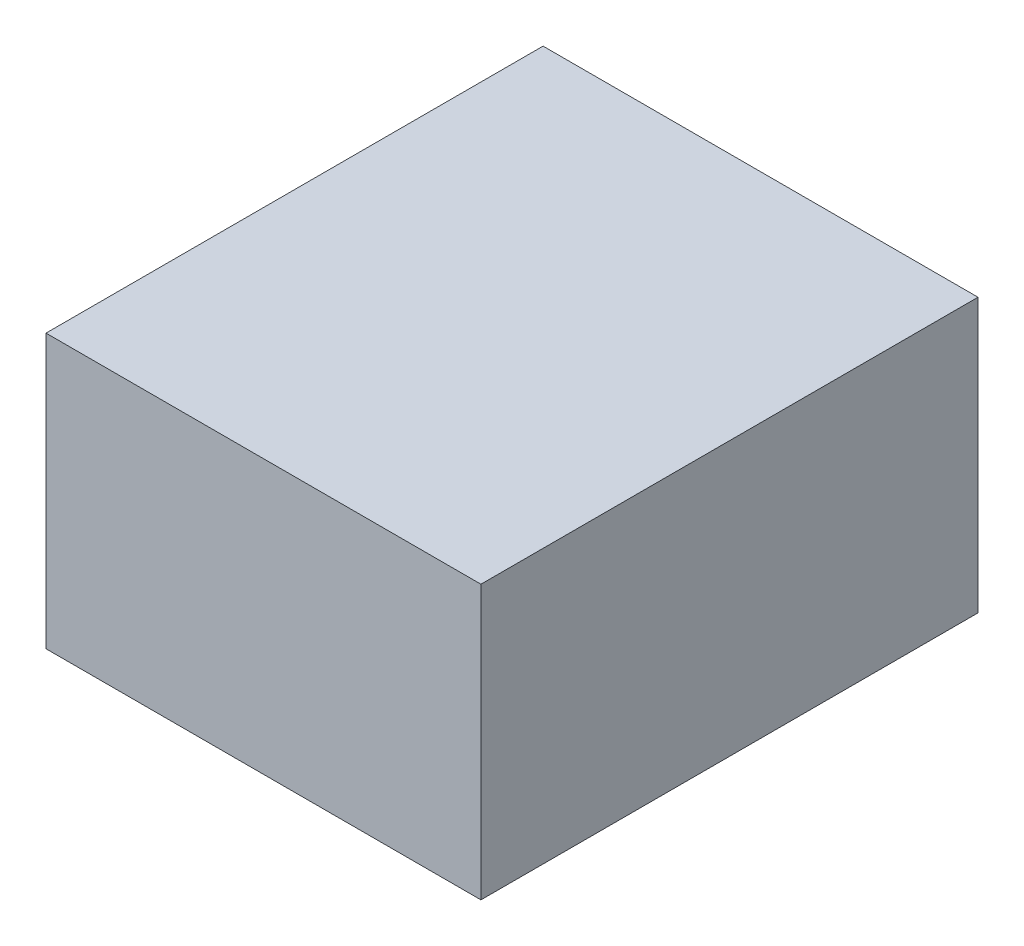
ISO-10303-21;
HEADER;
FILE_DESCRIPTION(('STEP AP214'),'2;1');
FILE_NAME('part.step','',(''),(''),'','','');
FILE_SCHEMA(('AUTOMOTIVE_DESIGN { 1 0 10303 214 1 1 1 1 }'));
ENDSEC;
DATA;
#1=APPLICATION_CONTEXT('core data for automotive mechanical design processes');
#2=APPLICATION_PROTOCOL_DEFINITION('international standard','automotive_design',2000,#1);
#3=PRODUCT_CONTEXT('',#1,'mechanical');
#4=PRODUCT('Part','Part','',(#3));
#5=PRODUCT_RELATED_PRODUCT_CATEGORY('part','',(#4));
#6=PRODUCT_DEFINITION_FORMATION('','',#4);
#7=PRODUCT_DEFINITION_CONTEXT('part definition',#1,'design');
#8=PRODUCT_DEFINITION('design','',#6,#7);
#9=PRODUCT_DEFINITION_SHAPE('','',#8);
#10=(LENGTH_UNIT() NAMED_UNIT(*) SI_UNIT(.MILLI.,.METRE.));
#11=(NAMED_UNIT(*) PLANE_ANGLE_UNIT() SI_UNIT($,.RADIAN.));
#12=(NAMED_UNIT(*) SI_UNIT($,.STERADIAN.) SOLID_ANGLE_UNIT());
#13=UNCERTAINTY_MEASURE_WITH_UNIT(LENGTH_MEASURE(1.E-05),#10,'distance_accuracy_value','');
#14=(GEOMETRIC_REPRESENTATION_CONTEXT(3) GLOBAL_UNCERTAINTY_ASSIGNED_CONTEXT((#13)) GLOBAL_UNIT_ASSIGNED_CONTEXT((#10,
#11,#12)) REPRESENTATION_CONTEXT('',''));
#15=CARTESIAN_POINT('',(0.,0.,0.));
#16=DIRECTION('',(0.,0.,1.));
#17=DIRECTION('',(1.,0.,0.));
#18=AXIS2_PLACEMENT_3D('',#15,#16,#17);
#19=CARTESIAN_POINT('',(-2.70780546111277,1.1,7.47731911389471));
#20=DIRECTION('',(1.,0.,0.));
#21=DIRECTION('',(0.,0.,-1.));
#22=AXIS2_PLACEMENT_3D('',#19,#20,#21);
#23=PLANE('',#22);
#24=DIRECTION('',(0.,0.,1.));
#25=VECTOR('',#24,1.);
#26=CARTESIAN_POINT('',(-2.70780546111277,0.,7.47731911389471));
#27=LINE('',#26,#25);
#28=CARTESIAN_POINT('',(-2.70780546111277,0.,7.47731911389471));
#29=VERTEX_POINT('',#28);
#30=CARTESIAN_POINT('',(-2.70780546111277,0.,9.47731911389471));
#31=VERTEX_POINT('',#30);
#32=EDGE_CURVE('E100',#29,#31,#27,.T.);
#33=ORIENTED_EDGE('',*,*,#32,.T.);
#34=DIRECTION('',(0.,-1.,0.));
#35=VECTOR('',#34,1.);
#36=CARTESIAN_POINT('',(-2.70780546111277,1.1,9.47731911389471));
#37=LINE('',#36,#35);
#38=CARTESIAN_POINT('',(-2.70780546111277,1.1,9.47731911389471));
#39=VERTEX_POINT('',#38);
#40=EDGE_CURVE('E11',#39,#31,#37,.T.);
#41=ORIENTED_EDGE('',*,*,#40,.F.);
#42=DIRECTION('',(0.,0.,1.));
#43=VECTOR('',#42,1.);
#44=CARTESIAN_POINT('',(-2.70780546111277,1.1,7.47731911389471));
#45=LINE('',#44,#43);
#46=CARTESIAN_POINT('',(-2.70780546111277,1.1,7.47731911389471));
#47=VERTEX_POINT('',#46);
#48=EDGE_CURVE('E88',#47,#39,#45,.T.);
#49=ORIENTED_EDGE('',*,*,#48,.F.);
#50=DIRECTION('',(0.,-1.,0.));
#51=VECTOR('',#50,1.);
#52=CARTESIAN_POINT('',(-2.70780546111277,1.1,7.47731911389471));
#53=LINE('',#52,#51);
#54=EDGE_CURVE('E96',#47,#29,#53,.T.);
#55=ORIENTED_EDGE('',*,*,#54,.T.);
#56=EDGE_LOOP('',(#33,#41,#49,#55));
#57=FACE_BOUND('',#56,.T.);
#58=ADVANCED_FACE('F37',(#57),#23,.F.);
#59=CARTESIAN_POINT('',(-2.70780546111277,1.1,9.47731911389471));
#60=DIRECTION('',(0.,0.,-1.));
#61=DIRECTION('',(-1.,0.,0.));
#62=AXIS2_PLACEMENT_3D('',#59,#60,#61);
#63=PLANE('',#62);
#64=DIRECTION('',(1.,0.,0.));
#65=VECTOR('',#64,1.);
#66=CARTESIAN_POINT('',(-2.70780546111277,0.,9.47731911389471));
#67=LINE('',#66,#65);
#68=CARTESIAN_POINT('',(-0.957805461112765,0.,9.47731911389471));
#69=VERTEX_POINT('',#68);
#70=EDGE_CURVE('E92',#31,#69,#67,.T.);
#71=ORIENTED_EDGE('',*,*,#70,.T.);
#72=DIRECTION('',(0.,-1.,0.));
#73=VECTOR('',#72,1.);
#74=CARTESIAN_POINT('',(-0.957805461112765,1.1,9.47731911389471));
#75=LINE('',#74,#73);
#76=CARTESIAN_POINT('',(-0.957805461112765,1.1,9.47731911389471));
#77=VERTEX_POINT('',#76);
#78=EDGE_CURVE('E45',#77,#69,#75,.T.);
#79=ORIENTED_EDGE('',*,*,#78,.F.);
#80=DIRECTION('',(1.,0.,0.));
#81=VECTOR('',#80,1.);
#82=CARTESIAN_POINT('',(-2.70780546111277,1.1,9.47731911389471));
#83=LINE('',#82,#81);
#84=EDGE_CURVE('E83',#39,#77,#83,.T.);
#85=ORIENTED_EDGE('',*,*,#84,.F.);
#86=ORIENTED_EDGE('',*,*,#40,.T.);
#87=EDGE_LOOP('',(#71,#79,#85,#86));
#88=FACE_BOUND('',#87,.T.);
#89=ADVANCED_FACE('F91',(#88),#63,.F.);
#90=CARTESIAN_POINT('',(-0.957805461112767,1.1,7.47731911389471));
#91=DIRECTION('',(-1.,0.,0.));
#92=DIRECTION('',(0.,0.,1.));
#93=AXIS2_PLACEMENT_3D('',#90,#91,#92);
#94=PLANE('',#93);
#95=DIRECTION('',(0.,0.,-1.));
#96=VECTOR('',#95,1.);
#97=CARTESIAN_POINT('',(-0.957805461112767,0.,7.47731911389471));
#98=LINE('',#97,#96);
#99=CARTESIAN_POINT('',(-0.957805461112767,0.,7.47731911389471));
#100=VERTEX_POINT('',#99);
#101=EDGE_CURVE('E70',#69,#100,#98,.T.);
#102=ORIENTED_EDGE('',*,*,#101,.T.);
#103=DIRECTION('',(0.,-1.,0.));
#104=VECTOR('',#103,1.);
#105=CARTESIAN_POINT('',(-0.957805461112767,1.1,7.47731911389471));
#106=LINE('',#105,#104);
#107=CARTESIAN_POINT('',(-0.957805461112767,1.1,7.47731911389471));
#108=VERTEX_POINT('',#107);
#109=EDGE_CURVE('E93',#108,#100,#106,.T.);
#110=ORIENTED_EDGE('',*,*,#109,.F.);
#111=DIRECTION('',(0.,0.,-1.));
#112=VECTOR('',#111,1.);
#113=CARTESIAN_POINT('',(-0.957805461112767,1.1,7.47731911389471));
#114=LINE('',#113,#112);
#115=EDGE_CURVE('E86',#77,#108,#114,.T.);
#116=ORIENTED_EDGE('',*,*,#115,.F.);
#117=ORIENTED_EDGE('',*,*,#78,.T.);
#118=EDGE_LOOP('',(#102,#110,#116,#117));
#119=FACE_BOUND('',#118,.T.);
#120=ADVANCED_FACE('F94',(#119),#94,.F.);
#121=CARTESIAN_POINT('',(-2.70780546111277,1.1,7.47731911389471));
#122=DIRECTION('',(0.,0.,1.));
#123=DIRECTION('',(1.,0.,0.));
#124=AXIS2_PLACEMENT_3D('',#121,#122,#123);
#125=PLANE('',#124);
#126=DIRECTION('',(-1.,0.,0.));
#127=VECTOR('',#126,1.);
#128=CARTESIAN_POINT('',(-2.70780546111277,0.,7.47731911389471));
#129=LINE('',#128,#127);
#130=EDGE_CURVE('E76',#100,#29,#129,.T.);
#131=ORIENTED_EDGE('',*,*,#130,.T.);
#132=ORIENTED_EDGE('',*,*,#54,.F.);
#133=DIRECTION('',(-1.,0.,0.));
#134=VECTOR('',#133,1.);
#135=CARTESIAN_POINT('',(-2.70780546111277,1.1,7.47731911389471));
#136=LINE('',#135,#134);
#137=EDGE_CURVE('E53',#108,#47,#136,.T.);
#138=ORIENTED_EDGE('',*,*,#137,.F.);
#139=ORIENTED_EDGE('',*,*,#109,.T.);
#140=EDGE_LOOP('',(#131,#132,#138,#139));
#141=FACE_BOUND('',#140,.T.);
#142=ADVANCED_FACE('F107',(#141),#125,.F.);
#143=CARTESIAN_POINT('',(0.,1.1,0.));
#144=DIRECTION('',(0.,1.,0.));
#145=DIRECTION('',(0.,0.,1.));
#146=AXIS2_PLACEMENT_3D('',#143,#144,#145);
#147=PLANE('',#146);
#148=ORIENTED_EDGE('',*,*,#48,.T.);
#149=ORIENTED_EDGE('',*,*,#84,.T.);
#150=ORIENTED_EDGE('',*,*,#115,.T.);
#151=ORIENTED_EDGE('',*,*,#137,.T.);
#152=EDGE_LOOP('',(#148,#149,#150,#151));
#153=FACE_BOUND('',#152,.T.);
#154=ADVANCED_FACE('F84',(#153),#147,.T.);
#155=CARTESIAN_POINT('',(0.,0.,0.));
#156=DIRECTION('',(0.,1.,0.));
#157=DIRECTION('',(0.,0.,1.));
#158=AXIS2_PLACEMENT_3D('',#155,#156,#157);
#159=PLANE('',#158);
#160=ORIENTED_EDGE('',*,*,#32,.F.);
#161=ORIENTED_EDGE('',*,*,#130,.F.);
#162=ORIENTED_EDGE('',*,*,#101,.F.);
#163=ORIENTED_EDGE('',*,*,#70,.F.);
#164=EDGE_LOOP('',(#160,#161,#162,#163));
#165=FACE_BOUND('',#164,.T.);
#166=ADVANCED_FACE('F110',(#165),#159,.F.);
#167=CLOSED_SHELL('',(#58,#89,#120,#142,#154,#166));
#168=MANIFOLD_SOLID_BREP('B2',#167);
#169=ADVANCED_BREP_SHAPE_REPRESENTATION('',(#18,#168),#14);
#170=SHAPE_DEFINITION_REPRESENTATION(#9,#169);
ENDSEC;
END-ISO-10303-21;
